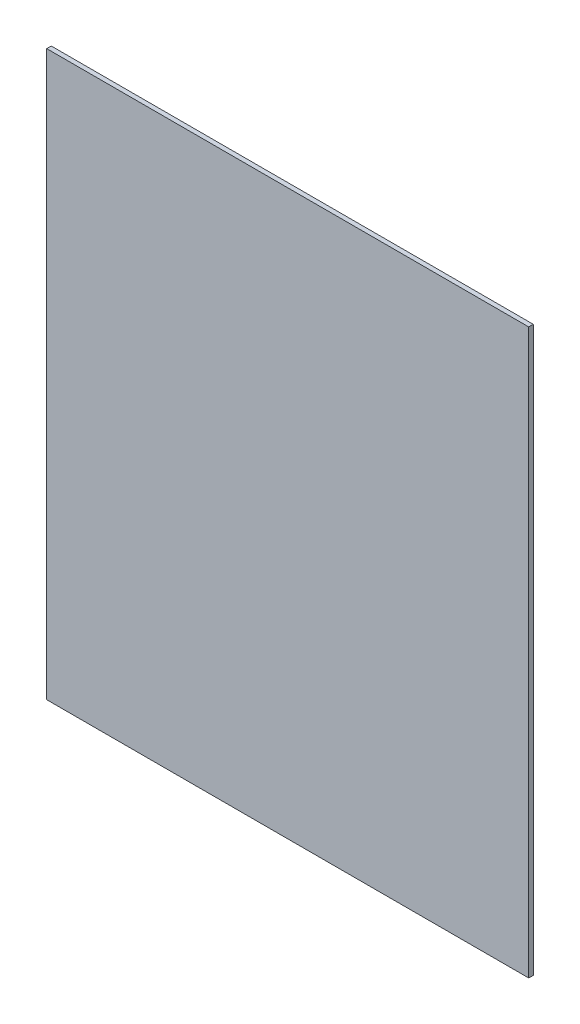
ISO-10303-21;
HEADER;
FILE_DESCRIPTION(('STEP AP214'),'2;1');
FILE_NAME('part.step','',(''),(''),'','','');
FILE_SCHEMA(('AUTOMOTIVE_DESIGN { 1 0 10303 214 1 1 1 1 }'));
ENDSEC;
DATA;
#1=APPLICATION_CONTEXT('core data for automotive mechanical design processes');
#2=APPLICATION_PROTOCOL_DEFINITION('international standard','automotive_design',2000,#1);
#3=PRODUCT_CONTEXT('',#1,'mechanical');
#4=PRODUCT('Part','Part','',(#3));
#5=PRODUCT_RELATED_PRODUCT_CATEGORY('part','',(#4));
#6=PRODUCT_DEFINITION_FORMATION('','',#4);
#7=PRODUCT_DEFINITION_CONTEXT('part definition',#1,'design');
#8=PRODUCT_DEFINITION('design','',#6,#7);
#9=PRODUCT_DEFINITION_SHAPE('','',#8);
#10=(LENGTH_UNIT() NAMED_UNIT(*) SI_UNIT(.MILLI.,.METRE.));
#11=(NAMED_UNIT(*) PLANE_ANGLE_UNIT() SI_UNIT($,.RADIAN.));
#12=(NAMED_UNIT(*) SI_UNIT($,.STERADIAN.) SOLID_ANGLE_UNIT());
#13=UNCERTAINTY_MEASURE_WITH_UNIT(LENGTH_MEASURE(1.E-05),#10,'distance_accuracy_value','');
#14=(GEOMETRIC_REPRESENTATION_CONTEXT(3) GLOBAL_UNCERTAINTY_ASSIGNED_CONTEXT((#13)) GLOBAL_UNIT_ASSIGNED_CONTEXT((#10,
#11,#12)) REPRESENTATION_CONTEXT('',''));
#15=CARTESIAN_POINT('',(0.,0.,0.));
#16=DIRECTION('',(0.,0.,1.));
#17=DIRECTION('',(1.,0.,0.));
#18=AXIS2_PLACEMENT_3D('',#15,#16,#17);
#19=CARTESIAN_POINT('',(265.,-310.,5.));
#20=DIRECTION('',(-1.,0.,0.));
#21=DIRECTION('',(0.,0.,1.));
#22=AXIS2_PLACEMENT_3D('',#19,#20,#21);
#23=PLANE('',#22);
#24=DIRECTION('',(0.,1.,0.));
#25=VECTOR('',#24,1.);
#26=CARTESIAN_POINT('',(265.,-310.,0.));
#27=LINE('',#26,#25);
#28=CARTESIAN_POINT('',(265.,-310.,0.));
#29=VERTEX_POINT('',#28);
#30=CARTESIAN_POINT('',(265.,310.,0.));
#31=VERTEX_POINT('',#30);
#32=EDGE_CURVE('E96',#29,#31,#27,.T.);
#33=ORIENTED_EDGE('',*,*,#32,.T.);
#34=DIRECTION('',(0.,0.,-1.));
#35=VECTOR('',#34,1.);
#36=CARTESIAN_POINT('',(265.,310.,5.));
#37=LINE('',#36,#35);
#38=CARTESIAN_POINT('',(265.,310.,5.));
#39=VERTEX_POINT('',#38);
#40=EDGE_CURVE('E11',#39,#31,#37,.T.);
#41=ORIENTED_EDGE('',*,*,#40,.F.);
#42=DIRECTION('',(0.,1.,0.));
#43=VECTOR('',#42,1.);
#44=CARTESIAN_POINT('',(265.,-310.,5.));
#45=LINE('',#44,#43);
#46=CARTESIAN_POINT('',(265.,-310.,5.));
#47=VERTEX_POINT('',#46);
#48=EDGE_CURVE('E84',#47,#39,#45,.T.);
#49=ORIENTED_EDGE('',*,*,#48,.F.);
#50=DIRECTION('',(0.,0.,-1.));
#51=VECTOR('',#50,1.);
#52=CARTESIAN_POINT('',(265.,-310.,5.));
#53=LINE('',#52,#51);
#54=EDGE_CURVE('E92',#47,#29,#53,.T.);
#55=ORIENTED_EDGE('',*,*,#54,.T.);
#56=EDGE_LOOP('',(#33,#41,#49,#55));
#57=FACE_BOUND('',#56,.T.);
#58=ADVANCED_FACE('F33',(#57),#23,.F.);
#59=CARTESIAN_POINT('',(-265.,310.,5.));
#60=DIRECTION('',(0.,-1.,0.));
#61=DIRECTION('',(0.,0.,-1.));
#62=AXIS2_PLACEMENT_3D('',#59,#60,#61);
#63=PLANE('',#62);
#64=DIRECTION('',(-1.,0.,0.));
#65=VECTOR('',#64,1.);
#66=CARTESIAN_POINT('',(-265.,310.,0.));
#67=LINE('',#66,#65);
#68=CARTESIAN_POINT('',(-265.,310.,0.));
#69=VERTEX_POINT('',#68);
#70=EDGE_CURVE('E88',#31,#69,#67,.T.);
#71=ORIENTED_EDGE('',*,*,#70,.T.);
#72=DIRECTION('',(0.,0.,-1.));
#73=VECTOR('',#72,1.);
#74=CARTESIAN_POINT('',(-265.,310.,5.));
#75=LINE('',#74,#73);
#76=CARTESIAN_POINT('',(-265.,310.,5.));
#77=VERTEX_POINT('',#76);
#78=EDGE_CURVE('E41',#77,#69,#75,.T.);
#79=ORIENTED_EDGE('',*,*,#78,.F.);
#80=DIRECTION('',(-1.,0.,0.));
#81=VECTOR('',#80,1.);
#82=CARTESIAN_POINT('',(-265.,310.,5.));
#83=LINE('',#82,#81);
#84=EDGE_CURVE('E79',#39,#77,#83,.T.);
#85=ORIENTED_EDGE('',*,*,#84,.F.);
#86=ORIENTED_EDGE('',*,*,#40,.T.);
#87=EDGE_LOOP('',(#71,#79,#85,#86));
#88=FACE_BOUND('',#87,.T.);
#89=ADVANCED_FACE('F87',(#88),#63,.F.);
#90=CARTESIAN_POINT('',(-265.,-310.,5.));
#91=DIRECTION('',(1.,0.,0.));
#92=DIRECTION('',(0.,0.,-1.));
#93=AXIS2_PLACEMENT_3D('',#90,#91,#92);
#94=PLANE('',#93);
#95=DIRECTION('',(0.,-1.,0.));
#96=VECTOR('',#95,1.);
#97=CARTESIAN_POINT('',(-265.,-310.,0.));
#98=LINE('',#97,#96);
#99=CARTESIAN_POINT('',(-265.,-310.,0.));
#100=VERTEX_POINT('',#99);
#101=EDGE_CURVE('E66',#69,#100,#98,.T.);
#102=ORIENTED_EDGE('',*,*,#101,.T.);
#103=DIRECTION('',(0.,0.,-1.));
#104=VECTOR('',#103,1.);
#105=CARTESIAN_POINT('',(-265.,-310.,5.));
#106=LINE('',#105,#104);
#107=CARTESIAN_POINT('',(-265.,-310.,5.));
#108=VERTEX_POINT('',#107);
#109=EDGE_CURVE('E89',#108,#100,#106,.T.);
#110=ORIENTED_EDGE('',*,*,#109,.F.);
#111=DIRECTION('',(0.,-1.,0.));
#112=VECTOR('',#111,1.);
#113=CARTESIAN_POINT('',(-265.,-310.,5.));
#114=LINE('',#113,#112);
#115=EDGE_CURVE('E82',#77,#108,#114,.T.);
#116=ORIENTED_EDGE('',*,*,#115,.F.);
#117=ORIENTED_EDGE('',*,*,#78,.T.);
#118=EDGE_LOOP('',(#102,#110,#116,#117));
#119=FACE_BOUND('',#118,.T.);
#120=ADVANCED_FACE('F90',(#119),#94,.F.);
#121=CARTESIAN_POINT('',(-265.,-310.,5.));
#122=DIRECTION('',(0.,1.,0.));
#123=DIRECTION('',(0.,0.,1.));
#124=AXIS2_PLACEMENT_3D('',#121,#122,#123);
#125=PLANE('',#124);
#126=DIRECTION('',(1.,0.,0.));
#127=VECTOR('',#126,1.);
#128=CARTESIAN_POINT('',(-265.,-310.,0.));
#129=LINE('',#128,#127);
#130=EDGE_CURVE('E72',#100,#29,#129,.T.);
#131=ORIENTED_EDGE('',*,*,#130,.T.);
#132=ORIENTED_EDGE('',*,*,#54,.F.);
#133=DIRECTION('',(1.,0.,0.));
#134=VECTOR('',#133,1.);
#135=CARTESIAN_POINT('',(-265.,-310.,5.));
#136=LINE('',#135,#134);
#137=EDGE_CURVE('E49',#108,#47,#136,.T.);
#138=ORIENTED_EDGE('',*,*,#137,.F.);
#139=ORIENTED_EDGE('',*,*,#109,.T.);
#140=EDGE_LOOP('',(#131,#132,#138,#139));
#141=FACE_BOUND('',#140,.T.);
#142=ADVANCED_FACE('F103',(#141),#125,.F.);
#143=CARTESIAN_POINT('',(0.,0.,5.));
#144=DIRECTION('',(0.,0.,-1.));
#145=DIRECTION('',(-1.,0.,0.));
#146=AXIS2_PLACEMENT_3D('',#143,#144,#145);
#147=PLANE('',#146);
#148=ORIENTED_EDGE('',*,*,#48,.T.);
#149=ORIENTED_EDGE('',*,*,#84,.T.);
#150=ORIENTED_EDGE('',*,*,#115,.T.);
#151=ORIENTED_EDGE('',*,*,#137,.T.);
#152=EDGE_LOOP('',(#148,#149,#150,#151));
#153=FACE_BOUND('',#152,.T.);
#154=ADVANCED_FACE('F80',(#153),#147,.F.);
#155=CARTESIAN_POINT('',(0.,0.,0.));
#156=DIRECTION('',(0.,0.,-1.));
#157=DIRECTION('',(-1.,0.,0.));
#158=AXIS2_PLACEMENT_3D('',#155,#156,#157);
#159=PLANE('',#158);
#160=ORIENTED_EDGE('',*,*,#32,.F.);
#161=ORIENTED_EDGE('',*,*,#130,.F.);
#162=ORIENTED_EDGE('',*,*,#101,.F.);
#163=ORIENTED_EDGE('',*,*,#70,.F.);
#164=EDGE_LOOP('',(#160,#161,#162,#163));
#165=FACE_BOUND('',#164,.T.);
#166=ADVANCED_FACE('F106',(#165),#159,.T.);
#167=CLOSED_SHELL('',(#58,#89,#120,#142,#154,#166));
#168=MANIFOLD_SOLID_BREP('B2',#167);
#169=ADVANCED_BREP_SHAPE_REPRESENTATION('',(#18,#168),#14);
#170=SHAPE_DEFINITION_REPRESENTATION(#9,#169);
ENDSEC;
END-ISO-10303-21;
